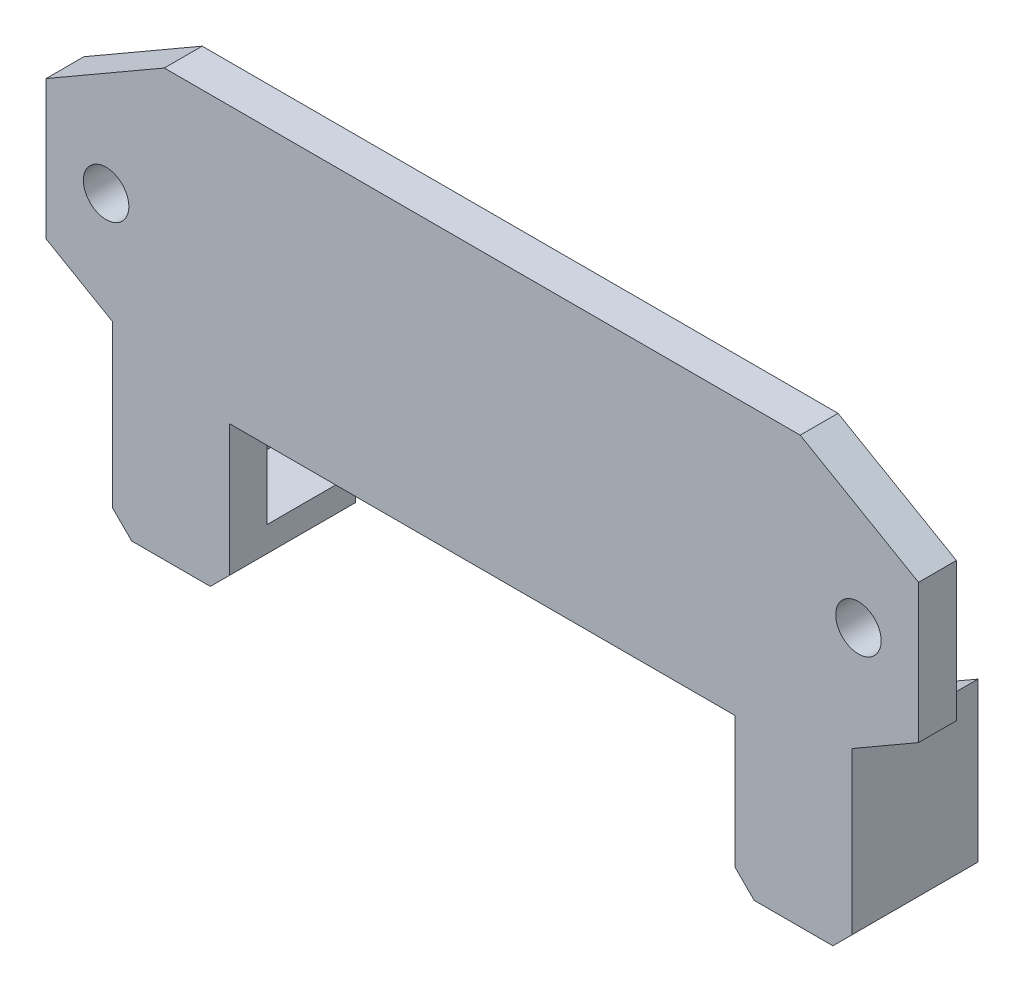
ISO-10303-21;
HEADER;
FILE_DESCRIPTION(('STEP AP214'),'2;1');
FILE_NAME('part.step','',(''),(''),'','','');
FILE_SCHEMA(('AUTOMOTIVE_DESIGN { 1 0 10303 214 1 1 1 1 }'));
ENDSEC;
DATA;
#1=APPLICATION_CONTEXT('core data for automotive mechanical design processes');
#2=APPLICATION_PROTOCOL_DEFINITION('international standard','automotive_design',2000,#1);
#3=PRODUCT_CONTEXT('',#1,'mechanical');
#4=PRODUCT('Part','Part','',(#3));
#5=PRODUCT_RELATED_PRODUCT_CATEGORY('part','',(#4));
#6=PRODUCT_DEFINITION_FORMATION('','',#4);
#7=PRODUCT_DEFINITION_CONTEXT('part definition',#1,'design');
#8=PRODUCT_DEFINITION('design','',#6,#7);
#9=PRODUCT_DEFINITION_SHAPE('','',#8);
#10=(LENGTH_UNIT() NAMED_UNIT(*) SI_UNIT(.MILLI.,.METRE.));
#11=(NAMED_UNIT(*) PLANE_ANGLE_UNIT() SI_UNIT($,.RADIAN.));
#12=(NAMED_UNIT(*) SI_UNIT($,.STERADIAN.) SOLID_ANGLE_UNIT());
#13=UNCERTAINTY_MEASURE_WITH_UNIT(LENGTH_MEASURE(1.E-05),#10,'distance_accuracy_value','');
#14=(GEOMETRIC_REPRESENTATION_CONTEXT(3) GLOBAL_UNCERTAINTY_ASSIGNED_CONTEXT((#13)) GLOBAL_UNIT_ASSIGNED_CONTEXT((#10,
#11,#12)) REPRESENTATION_CONTEXT('',''));
#15=CARTESIAN_POINT('',(0.,0.,0.));
#16=DIRECTION('',(0.,0.,1.));
#17=DIRECTION('',(1.,0.,0.));
#18=AXIS2_PLACEMENT_3D('',#15,#16,#17);
#19=CARTESIAN_POINT('',(25.2,-70.05,-7.));
#20=DIRECTION('',(0.,1.,0.));
#21=DIRECTION('',(0.,0.,1.));
#22=AXIS2_PLACEMENT_3D('',#19,#20,#21);
#23=PLANE('',#22);
#24=DIRECTION('',(-1.,0.,0.));
#25=VECTOR('',#24,1.);
#26=CARTESIAN_POINT('',(25.2,-70.05,0.));
#27=LINE('',#26,#25);
#28=CARTESIAN_POINT('',(25.2,-70.05,0.));
#29=VERTEX_POINT('',#28);
#30=CARTESIAN_POINT('',(20.05,-70.05,0.));
#31=VERTEX_POINT('',#30);
#32=EDGE_CURVE('E130',#29,#31,#27,.T.);
#33=ORIENTED_EDGE('',*,*,#32,.F.);
#34=DIRECTION('',(0.,0.,1.));
#35=VECTOR('',#34,1.);
#36=CARTESIAN_POINT('',(25.2,-70.05,-7.));
#37=LINE('',#36,#35);
#38=CARTESIAN_POINT('',(25.2,-70.05,-7.));
#39=VERTEX_POINT('',#38);
#40=EDGE_CURVE('E11',#39,#29,#37,.T.);
#41=ORIENTED_EDGE('',*,*,#40,.F.);
#42=DIRECTION('',(-1.,0.,0.));
#43=VECTOR('',#42,1.);
#44=CARTESIAN_POINT('',(25.2,-70.05,-7.));
#45=LINE('',#44,#43);
#46=CARTESIAN_POINT('',(20.05,-70.05,-7.));
#47=VERTEX_POINT('',#46);
#48=EDGE_CURVE('E137',#39,#47,#45,.T.);
#49=ORIENTED_EDGE('',*,*,#48,.T.);
#50=DIRECTION('',(0.,0.,1.));
#51=VECTOR('',#50,1.);
#52=CARTESIAN_POINT('',(20.05,-70.05,-7.));
#53=LINE('',#52,#51);
#54=EDGE_CURVE('E37',#47,#31,#53,.T.);
#55=ORIENTED_EDGE('',*,*,#54,.T.);
#56=EDGE_LOOP('',(#33,#41,#49,#55));
#57=FACE_BOUND('',#56,.T.);
#58=ADVANCED_FACE('F34',(#57),#23,.T.);
#59=CARTESIAN_POINT('',(25.2,-61.8493375672968,-7.));
#60=DIRECTION('',(-1.,0.,0.));
#61=DIRECTION('',(0.,-1.,0.));
#62=AXIS2_PLACEMENT_3D('',#59,#60,#61);
#63=PLANE('',#62);
#64=DIRECTION('',(0.,-1.,0.));
#65=VECTOR('',#64,1.);
#66=CARTESIAN_POINT('',(25.2,-61.8493375672968,0.));
#67=LINE('',#66,#65);
#68=CARTESIAN_POINT('',(25.2,-61.8493375672968,0.));
#69=VERTEX_POINT('',#68);
#70=EDGE_CURVE('E135',#69,#29,#67,.T.);
#71=ORIENTED_EDGE('',*,*,#70,.F.);
#72=DIRECTION('',(0.,0.,1.));
#73=VECTOR('',#72,1.);
#74=CARTESIAN_POINT('',(25.2,-61.8493375672968,-7.));
#75=LINE('',#74,#73);
#76=CARTESIAN_POINT('',(25.2,-61.8493375672968,-7.));
#77=VERTEX_POINT('',#76);
#78=EDGE_CURVE('E42',#77,#69,#75,.T.);
#79=ORIENTED_EDGE('',*,*,#78,.F.);
#80=DIRECTION('',(0.,-1.,0.));
#81=VECTOR('',#80,1.);
#82=CARTESIAN_POINT('',(25.2,-61.8493375672968,-7.));
#83=LINE('',#82,#81);
#84=EDGE_CURVE('E118',#77,#39,#83,.T.);
#85=ORIENTED_EDGE('',*,*,#84,.T.);
#86=ORIENTED_EDGE('',*,*,#40,.T.);
#87=EDGE_LOOP('',(#71,#79,#85,#86));
#88=FACE_BOUND('',#87,.T.);
#89=ADVANCED_FACE('F496',(#88),#63,.T.);
#90=CARTESIAN_POINT('',(25.2,-61.8493375672968,-7.));
#91=DIRECTION('',(-0.5,0.866025403784438,0.));
#92=DIRECTION('',(-0.866025403784439,-0.5,0.));
#93=AXIS2_PLACEMENT_3D('',#90,#91,#92);
#94=PLANE('',#93);
#95=DIRECTION('',(-0.866025403784438,-0.5,0.));
#96=VECTOR('',#95,1.);
#97=CARTESIAN_POINT('',(25.2,-61.8493375672968,0.));
#98=LINE('',#97,#96);
#99=CARTESIAN_POINT('',(29.2892350986239,-59.4884165823266,0.));
#100=VERTEX_POINT('',#99);
#101=EDGE_CURVE('E104',#100,#69,#98,.T.);
#102=ORIENTED_EDGE('',*,*,#101,.F.);
#103=DIRECTION('',(0.,0.,1.));
#104=VECTOR('',#103,1.);
#105=CARTESIAN_POINT('',(29.2892350986239,-59.4884165823266,-7.));
#106=LINE('',#105,#104);
#107=CARTESIAN_POINT('',(29.2892350986239,-59.4884165823266,-7.));
#108=VERTEX_POINT('',#107);
#109=EDGE_CURVE('E98',#108,#100,#106,.T.);
#110=ORIENTED_EDGE('',*,*,#109,.F.);
#111=DIRECTION('',(-0.866025403784438,-0.5,0.));
#112=VECTOR('',#111,1.);
#113=CARTESIAN_POINT('',(25.2,-61.8493375672968,-7.));
#114=LINE('',#113,#112);
#115=EDGE_CURVE('E101',#108,#77,#114,.T.);
#116=ORIENTED_EDGE('',*,*,#115,.T.);
#117=ORIENTED_EDGE('',*,*,#78,.T.);
#118=EDGE_LOOP('',(#102,#110,#116,#117));
#119=FACE_BOUND('',#118,.T.);
#120=ADVANCED_FACE('F100',(#119),#94,.T.);
#121=CARTESIAN_POINT('',(29.2892350986244,-72.05,-7.));
#122=DIRECTION('',(1.,0.,0.));
#123=DIRECTION('',(0.,1.,0.));
#124=AXIS2_PLACEMENT_3D('',#121,#122,#123);
#125=PLANE('',#124);
#126=ORIENTED_EDGE('',*,*,#109,.T.);
#127=DIRECTION('',(0.,1.,0.));
#128=VECTOR('',#127,1.);
#129=CARTESIAN_POINT('',(29.2892350986244,-72.05,0.));
#130=LINE('',#129,#128);
#131=CARTESIAN_POINT('',(29.2892350986244,-59.2574764746505,0.));
#132=VERTEX_POINT('',#131);
#133=EDGE_CURVE('E162',#100,#132,#130,.T.);
#134=ORIENTED_EDGE('',*,*,#133,.T.);
#135=DIRECTION('',(0.,0.,-1.));
#136=VECTOR('',#135,1.);
#137=CARTESIAN_POINT('',(29.2892350986244,-59.2574764746505,3.));
#138=LINE('',#137,#136);
#139=CARTESIAN_POINT('',(29.2892350986244,-59.2574764746505,3.));
#140=VERTEX_POINT('',#139);
#141=EDGE_CURVE('E178',#140,#132,#138,.T.);
#142=ORIENTED_EDGE('',*,*,#141,.F.);
#143=DIRECTION('',(0.,1.,0.));
#144=VECTOR('',#143,1.);
#145=CARTESIAN_POINT('',(29.2892350986244,-72.05,3.));
#146=LINE('',#145,#144);
#147=CARTESIAN_POINT('',(29.2892350986244,-72.05,3.));
#148=VERTEX_POINT('',#147);
#149=EDGE_CURVE('E248',#148,#140,#146,.T.);
#150=ORIENTED_EDGE('',*,*,#149,.F.);
#151=DIRECTION('',(0.,0.,1.));
#152=VECTOR('',#151,1.);
#153=CARTESIAN_POINT('',(29.2892350986244,-72.05,-7.));
#154=LINE('',#153,#152);
#155=CARTESIAN_POINT('',(29.2892350986244,-72.05,-7.));
#156=VERTEX_POINT('',#155);
#157=EDGE_CURVE('E109',#156,#148,#154,.T.);
#158=ORIENTED_EDGE('',*,*,#157,.F.);
#159=DIRECTION('',(0.,1.,0.));
#160=VECTOR('',#159,1.);
#161=CARTESIAN_POINT('',(29.2892350986244,-72.05,-7.));
#162=LINE('',#161,#160);
#163=EDGE_CURVE('E115',#156,#108,#162,.T.);
#164=ORIENTED_EDGE('',*,*,#163,.T.);
#165=EDGE_LOOP('',(#126,#134,#142,#150,#158,#164));
#166=FACE_BOUND('',#165,.T.);
#167=ADVANCED_FACE('F120',(#166),#125,.T.);
#168=CARTESIAN_POINT('',(27.7892350986244,-73.55,-7.));
#169=DIRECTION('',(0.707106781186556,-0.707106781186539,0.));
#170=DIRECTION('',(0.707106781186539,0.707106781186556,0.));
#171=AXIS2_PLACEMENT_3D('',#168,#169,#170);
#172=PLANE('',#171);
#173=ORIENTED_EDGE('',*,*,#157,.T.);
#174=DIRECTION('',(0.707106781186539,0.707106781186556,0.));
#175=VECTOR('',#174,1.);
#176=CARTESIAN_POINT('',(27.7892350986244,-73.55,3.));
#177=LINE('',#176,#175);
#178=CARTESIAN_POINT('',(27.7892350986244,-73.55,3.));
#179=VERTEX_POINT('',#178);
#180=EDGE_CURVE('E240',#179,#148,#177,.T.);
#181=ORIENTED_EDGE('',*,*,#180,.F.);
#182=DIRECTION('',(0.,0.,1.));
#183=VECTOR('',#182,1.);
#184=CARTESIAN_POINT('',(27.7892350986244,-73.55,-7.));
#185=LINE('',#184,#183);
#186=CARTESIAN_POINT('',(27.7892350986244,-73.55,-7.));
#187=VERTEX_POINT('',#186);
#188=EDGE_CURVE('E141',#187,#179,#185,.T.);
#189=ORIENTED_EDGE('',*,*,#188,.F.);
#190=DIRECTION('',(0.707106781186539,0.707106781186556,0.));
#191=VECTOR('',#190,1.);
#192=CARTESIAN_POINT('',(27.7892350986244,-73.55,-7.));
#193=LINE('',#192,#191);
#194=EDGE_CURVE('E123',#187,#156,#193,.T.);
#195=ORIENTED_EDGE('',*,*,#194,.T.);
#196=EDGE_LOOP('',(#173,#181,#189,#195));
#197=FACE_BOUND('',#196,.T.);
#198=ADVANCED_FACE('F486',(#197),#172,.T.);
#199=CARTESIAN_POINT('',(21.55,-73.55,-7.));
#200=DIRECTION('',(0.,-1.,0.));
#201=DIRECTION('',(0.,0.,-1.));
#202=AXIS2_PLACEMENT_3D('',#199,#200,#201);
#203=PLANE('',#202);
#204=ORIENTED_EDGE('',*,*,#188,.T.);
#205=DIRECTION('',(1.,0.,0.));
#206=VECTOR('',#205,1.);
#207=CARTESIAN_POINT('',(21.55,-73.55,3.));
#208=LINE('',#207,#206);
#209=CARTESIAN_POINT('',(21.55,-73.55,3.));
#210=VERTEX_POINT('',#209);
#211=EDGE_CURVE('E237',#210,#179,#208,.T.);
#212=ORIENTED_EDGE('',*,*,#211,.F.);
#213=DIRECTION('',(0.,0.,1.));
#214=VECTOR('',#213,1.);
#215=CARTESIAN_POINT('',(21.55,-73.55,-7.));
#216=LINE('',#215,#214);
#217=CARTESIAN_POINT('',(21.55,-73.55,-7.));
#218=VERTEX_POINT('',#217);
#219=EDGE_CURVE('E144',#218,#210,#216,.T.);
#220=ORIENTED_EDGE('',*,*,#219,.F.);
#221=DIRECTION('',(1.,0.,0.));
#222=VECTOR('',#221,1.);
#223=CARTESIAN_POINT('',(21.55,-73.55,-7.));
#224=LINE('',#223,#222);
#225=EDGE_CURVE('E125',#218,#187,#224,.T.);
#226=ORIENTED_EDGE('',*,*,#225,.T.);
#227=EDGE_LOOP('',(#204,#212,#220,#226));
#228=FACE_BOUND('',#227,.T.);
#229=ADVANCED_FACE('F223',(#228),#203,.T.);
#230=CARTESIAN_POINT('',(20.05,-72.05,-7.));
#231=DIRECTION('',(-0.707106781186541,-0.707106781186554,0.));
#232=DIRECTION('',(0.707106781186554,-0.707106781186541,0.));
#233=AXIS2_PLACEMENT_3D('',#230,#231,#232);
#234=PLANE('',#233);
#235=ORIENTED_EDGE('',*,*,#219,.T.);
#236=DIRECTION('',(0.707106781186554,-0.707106781186541,0.));
#237=VECTOR('',#236,1.);
#238=CARTESIAN_POINT('',(20.05,-72.05,3.));
#239=LINE('',#238,#237);
#240=CARTESIAN_POINT('',(20.05,-72.05,3.));
#241=VERTEX_POINT('',#240);
#242=EDGE_CURVE('E233',#241,#210,#239,.T.);
#243=ORIENTED_EDGE('',*,*,#242,.F.);
#244=DIRECTION('',(0.,0.,1.));
#245=VECTOR('',#244,1.);
#246=CARTESIAN_POINT('',(20.05,-72.05,-7.));
#247=LINE('',#246,#245);
#248=CARTESIAN_POINT('',(20.05,-72.05,-7.));
#249=VERTEX_POINT('',#248);
#250=EDGE_CURVE('E146',#249,#241,#247,.T.);
#251=ORIENTED_EDGE('',*,*,#250,.F.);
#252=DIRECTION('',(0.707106781186554,-0.707106781186541,0.));
#253=VECTOR('',#252,1.);
#254=CARTESIAN_POINT('',(20.05,-72.05,-7.));
#255=LINE('',#254,#253);
#256=EDGE_CURVE('E218',#249,#218,#255,.T.);
#257=ORIENTED_EDGE('',*,*,#256,.T.);
#258=EDGE_LOOP('',(#235,#243,#251,#257));
#259=FACE_BOUND('',#258,.T.);
#260=ADVANCED_FACE('F229',(#259),#234,.T.);
#261=CARTESIAN_POINT('',(20.05,-70.05,-7.));
#262=DIRECTION('',(-1.,0.,0.));
#263=DIRECTION('',(0.,0.,1.));
#264=AXIS2_PLACEMENT_3D('',#261,#262,#263);
#265=PLANE('',#264);
#266=ORIENTED_EDGE('',*,*,#250,.T.);
#267=DIRECTION('',(0.,-1.,0.));
#268=VECTOR('',#267,1.);
#269=CARTESIAN_POINT('',(20.05,-72.05,3.));
#270=LINE('',#269,#268);
#271=CARTESIAN_POINT('',(20.05,-61.6183974596209,3.));
#272=VERTEX_POINT('',#271);
#273=EDGE_CURVE('E238',#272,#241,#270,.T.);
#274=ORIENTED_EDGE('',*,*,#273,.F.);
#275=DIRECTION('',(0.,0.,-1.));
#276=VECTOR('',#275,1.);
#277=CARTESIAN_POINT('',(20.05,-61.6183974596209,3.));
#278=LINE('',#277,#276);
#279=CARTESIAN_POINT('',(20.05,-61.6183974596209,0.));
#280=VERTEX_POINT('',#279);
#281=EDGE_CURVE('E161',#272,#280,#278,.T.);
#282=ORIENTED_EDGE('',*,*,#281,.T.);
#283=DIRECTION('',(0.,-1.,0.));
#284=VECTOR('',#283,1.);
#285=CARTESIAN_POINT('',(20.05,-72.05,0.));
#286=LINE('',#285,#284);
#287=EDGE_CURVE('E157',#280,#31,#286,.T.);
#288=ORIENTED_EDGE('',*,*,#287,.T.);
#289=ORIENTED_EDGE('',*,*,#54,.F.);
#290=DIRECTION('',(0.,-1.,0.));
#291=VECTOR('',#290,1.);
#292=CARTESIAN_POINT('',(20.05,-70.05,-7.));
#293=LINE('',#292,#291);
#294=EDGE_CURVE('E216',#47,#249,#293,.T.);
#295=ORIENTED_EDGE('',*,*,#294,.T.);
#296=EDGE_LOOP('',(#266,#274,#282,#288,#289,#295));
#297=FACE_BOUND('',#296,.T.);
#298=ADVANCED_FACE('F159',(#297),#265,.T.);
#299=CARTESIAN_POINT('',(0.,0.,-7.));
#300=DIRECTION('',(0.,0.,1.));
#301=DIRECTION('',(1.,0.,0.));
#302=AXIS2_PLACEMENT_3D('',#299,#300,#301);
#303=PLANE('',#302);
#304=ORIENTED_EDGE('',*,*,#48,.F.);
#305=ORIENTED_EDGE('',*,*,#84,.F.);
#306=ORIENTED_EDGE('',*,*,#115,.F.);
#307=ORIENTED_EDGE('',*,*,#163,.F.);
#308=ORIENTED_EDGE('',*,*,#194,.F.);
#309=ORIENTED_EDGE('',*,*,#225,.F.);
#310=ORIENTED_EDGE('',*,*,#256,.F.);
#311=ORIENTED_EDGE('',*,*,#294,.F.);
#312=EDGE_LOOP('',(#304,#305,#306,#307,#308,#309,#310,#311));
#313=FACE_BOUND('',#312,.T.);
#314=ADVANCED_FACE('F113',(#313),#303,.F.);
#315=CARTESIAN_POINT('',(0.,0.,0.));
#316=DIRECTION('',(0.,0.,1.));
#317=DIRECTION('',(1.,0.,0.));
#318=AXIS2_PLACEMENT_3D('',#315,#316,#317);
#319=PLANE('',#318);
#320=CARTESIAN_POINT('',(29.8131397208144,-50.7049999999993,0.));
#321=DIRECTION('',(0.,0.,1.));
#322=DIRECTION('',(1.,0.,0.));
#323=AXIS2_PLACEMENT_3D('',#320,#321,#322);
#324=CIRCLE('',#323,1.8);
#325=CARTESIAN_POINT('',(31.6131397208144,-50.7049999999993,0.));
#326=VERTEX_POINT('',#325);
#327=EDGE_CURVE('E325',#326,#326,#324,.T.);
#328=ORIENTED_EDGE('',*,*,#327,.T.);
#329=EDGE_LOOP('',(#328));
#330=FACE_BOUND('',#329,.T.);
#331=CARTESIAN_POINT('',(-29.8131397208144,-50.7049999999993,0.));
#332=DIRECTION('',(0.,0.,1.));
#333=DIRECTION('',(-1.,0.,0.));
#334=AXIS2_PLACEMENT_3D('',#331,#332,#333);
#335=CIRCLE('',#334,1.8);
#336=CARTESIAN_POINT('',(-31.6131397208144,-50.7049999999993,0.));
#337=VERTEX_POINT('',#336);
#338=EDGE_CURVE('E331',#337,#337,#335,.T.);
#339=ORIENTED_EDGE('',*,*,#338,.T.);
#340=EDGE_LOOP('',(#339));
#341=FACE_BOUND('',#340,.T.);
#342=DIRECTION('',(0.,1.,0.));
#343=VECTOR('',#342,1.);
#344=CARTESIAN_POINT('',(-25.2,-61.8493375672968,0.));
#345=LINE('',#344,#343);
#346=CARTESIAN_POINT('',(-25.2,-70.05,0.));
#347=VERTEX_POINT('',#346);
#348=CARTESIAN_POINT('',(-25.2,-61.8493375672968,0.));
#349=VERTEX_POINT('',#348);
#350=EDGE_CURVE('E350',#347,#349,#345,.T.);
#351=ORIENTED_EDGE('',*,*,#350,.T.);
#352=DIRECTION('',(-0.866025403784438,0.5,0.));
#353=VECTOR('',#352,1.);
#354=CARTESIAN_POINT('',(-25.2,-61.8493375672968,0.));
#355=LINE('',#354,#353);
#356=CARTESIAN_POINT('',(-29.2892350986239,-59.4884165823266,0.));
#357=VERTEX_POINT('',#356);
#358=EDGE_CURVE('E346',#349,#357,#355,.T.);
#359=ORIENTED_EDGE('',*,*,#358,.T.);
#360=DIRECTION('',(0.,-1.,0.));
#361=VECTOR('',#360,1.);
#362=CARTESIAN_POINT('',(-29.2892350986244,-72.05,0.));
#363=LINE('',#362,#361);
#364=CARTESIAN_POINT('',(-29.2892350986244,-59.2574764746505,0.));
#365=VERTEX_POINT('',#364);
#366=EDGE_CURVE('E272',#365,#357,#363,.T.);
#367=ORIENTED_EDGE('',*,*,#366,.F.);
#368=DIRECTION('',(0.866025403784439,-0.5,0.));
#369=VECTOR('',#368,1.);
#370=CARTESIAN_POINT('',(-29.2892350986244,-59.2574764746505,0.));
#371=LINE('',#370,#369);
#372=CARTESIAN_POINT('',(-34.5762794416288,-56.2049999999993,0.));
#373=VERTEX_POINT('',#372);
#374=EDGE_CURVE('E269',#373,#365,#371,.T.);
#375=ORIENTED_EDGE('',*,*,#374,.F.);
#376=DIRECTION('',(0.,-1.,0.));
#377=VECTOR('',#376,1.);
#378=CARTESIAN_POINT('',(-34.5762794416288,-56.2049999999993,0.));
#379=LINE('',#378,#377);
#380=CARTESIAN_POINT('',(-34.5762794416288,-45.2049999999993,0.));
#381=VERTEX_POINT('',#380);
#382=EDGE_CURVE('E266',#381,#373,#379,.T.);
#383=ORIENTED_EDGE('',*,*,#382,.F.);
#384=DIRECTION('',(-0.866025403784439,-0.499999999999999,0.));
#385=VECTOR('',#384,1.);
#386=CARTESIAN_POINT('',(-34.5762794416288,-45.2049999999993,0.));
#387=LINE('',#386,#385);
#388=CARTESIAN_POINT('',(-25.2,-39.7916025403778,0.));
#389=VERTEX_POINT('',#388);
#390=EDGE_CURVE('E263',#389,#381,#387,.T.);
#391=ORIENTED_EDGE('',*,*,#390,.F.);
#392=DIRECTION('',(-1.,0.,0.));
#393=VECTOR('',#392,1.);
#394=CARTESIAN_POINT('',(25.2,-39.7916025403778,0.));
#395=LINE('',#394,#393);
#396=CARTESIAN_POINT('',(25.2,-39.7916025403778,0.));
#397=VERTEX_POINT('',#396);
#398=EDGE_CURVE('E260',#397,#389,#395,.T.);
#399=ORIENTED_EDGE('',*,*,#398,.F.);
#400=DIRECTION('',(-0.866025403784439,0.499999999999999,0.));
#401=VECTOR('',#400,1.);
#402=CARTESIAN_POINT('',(34.5762794416288,-45.2049999999993,0.));
#403=LINE('',#402,#401);
#404=CARTESIAN_POINT('',(34.5762794416288,-45.2049999999993,0.));
#405=VERTEX_POINT('',#404);
#406=EDGE_CURVE('E256',#405,#397,#403,.T.);
#407=ORIENTED_EDGE('',*,*,#406,.F.);
#408=DIRECTION('',(0.,1.,0.));
#409=VECTOR('',#408,1.);
#410=CARTESIAN_POINT('',(34.5762794416288,-56.2049999999993,0.));
#411=LINE('',#410,#409);
#412=CARTESIAN_POINT('',(34.5762794416288,-56.2049999999993,0.));
#413=VERTEX_POINT('',#412);
#414=EDGE_CURVE('E253',#413,#405,#411,.T.);
#415=ORIENTED_EDGE('',*,*,#414,.F.);
#416=DIRECTION('',(0.866025403784439,0.5,0.));
#417=VECTOR('',#416,1.);
#418=CARTESIAN_POINT('',(29.2892350986244,-59.2574764746505,0.));
#419=LINE('',#418,#417);
#420=EDGE_CURVE('E165',#132,#413,#419,.T.);
#421=ORIENTED_EDGE('',*,*,#420,.F.);
#422=ORIENTED_EDGE('',*,*,#133,.F.);
#423=ORIENTED_EDGE('',*,*,#101,.T.);
#424=ORIENTED_EDGE('',*,*,#70,.T.);
#425=ORIENTED_EDGE('',*,*,#32,.T.);
#426=ORIENTED_EDGE('',*,*,#287,.F.);
#427=DIRECTION('',(1.,0.,0.));
#428=VECTOR('',#427,1.);
#429=CARTESIAN_POINT('',(20.05,-61.6183974596209,0.));
#430=LINE('',#429,#428);
#431=CARTESIAN_POINT('',(-20.05,-61.6183974596209,0.));
#432=VERTEX_POINT('',#431);
#433=EDGE_CURVE('E163',#432,#280,#430,.T.);
#434=ORIENTED_EDGE('',*,*,#433,.F.);
#435=DIRECTION('',(0.,1.,0.));
#436=VECTOR('',#435,1.);
#437=CARTESIAN_POINT('',(-20.05,-72.05,0.));
#438=LINE('',#437,#436);
#439=CARTESIAN_POINT('',(-20.05,-70.05,0.));
#440=VERTEX_POINT('',#439);
#441=EDGE_CURVE('E168',#440,#432,#438,.T.);
#442=ORIENTED_EDGE('',*,*,#441,.F.);
#443=DIRECTION('',(-1.,0.,0.));
#444=VECTOR('',#443,1.);
#445=CARTESIAN_POINT('',(-25.2,-70.05,0.));
#446=LINE('',#445,#444);
#447=EDGE_CURVE('E50',#440,#347,#446,.T.);
#448=ORIENTED_EDGE('',*,*,#447,.T.);
#449=EDGE_LOOP('',(#351,#359,#367,#375,#383,#391,#399,#407,#415,#421,#422,#423,#424,#425,#426,
#434,#442,#448));
#450=FACE_BOUND('',#449,.T.);
#451=ADVANCED_FACE('F154',(#330,#341,#450),#319,.F.);
#452=CARTESIAN_POINT('',(0.,0.,3.));
#453=DIRECTION('',(0.,0.,1.));
#454=DIRECTION('',(1.,0.,0.));
#455=AXIS2_PLACEMENT_3D('',#452,#453,#454);
#456=PLANE('',#455);
#457=CARTESIAN_POINT('',(29.8131397208144,-50.7049999999993,3.));
#458=DIRECTION('',(0.,0.,1.));
#459=DIRECTION('',(1.,0.,0.));
#460=AXIS2_PLACEMENT_3D('',#457,#458,#459);
#461=CIRCLE('',#460,1.8);
#462=CARTESIAN_POINT('',(31.6131397208144,-50.7049999999993,3.));
#463=VERTEX_POINT('',#462);
#464=EDGE_CURVE('E257',#463,#463,#461,.T.);
#465=ORIENTED_EDGE('',*,*,#464,.F.);
#466=EDGE_LOOP('',(#465));
#467=FACE_BOUND('',#466,.T.);
#468=DIRECTION('',(0.,1.,0.));
#469=VECTOR('',#468,1.);
#470=CARTESIAN_POINT('',(34.5762794416288,-56.2049999999993,3.));
#471=LINE('',#470,#469);
#472=CARTESIAN_POINT('',(34.5762794416288,-56.2049999999993,3.));
#473=VERTEX_POINT('',#472);
#474=CARTESIAN_POINT('',(34.5762794416288,-45.2049999999993,3.));
#475=VERTEX_POINT('',#474);
#476=EDGE_CURVE('E174',#473,#475,#471,.T.);
#477=ORIENTED_EDGE('',*,*,#476,.T.);
#478=DIRECTION('',(-0.866025403784439,0.499999999999999,0.));
#479=VECTOR('',#478,1.);
#480=CARTESIAN_POINT('',(34.5762794416288,-45.2049999999993,3.));
#481=LINE('',#480,#479);
#482=CARTESIAN_POINT('',(25.2,-39.7916025403778,3.));
#483=VERTEX_POINT('',#482);
#484=EDGE_CURVE('E320',#475,#483,#481,.T.);
#485=ORIENTED_EDGE('',*,*,#484,.T.);
#486=DIRECTION('',(-1.,0.,0.));
#487=VECTOR('',#486,1.);
#488=CARTESIAN_POINT('',(25.2,-39.7916025403778,3.));
#489=LINE('',#488,#487);
#490=CARTESIAN_POINT('',(-25.2,-39.7916025403778,3.));
#491=VERTEX_POINT('',#490);
#492=EDGE_CURVE('E317',#483,#491,#489,.T.);
#493=ORIENTED_EDGE('',*,*,#492,.T.);
#494=DIRECTION('',(-0.866025403784439,-0.499999999999999,0.));
#495=VECTOR('',#494,1.);
#496=CARTESIAN_POINT('',(-34.5762794416288,-45.2049999999993,3.));
#497=LINE('',#496,#495);
#498=CARTESIAN_POINT('',(-34.5762794416288,-45.2049999999993,3.));
#499=VERTEX_POINT('',#498);
#500=EDGE_CURVE('E314',#491,#499,#497,.T.);
#501=ORIENTED_EDGE('',*,*,#500,.T.);
#502=DIRECTION('',(0.,-1.,0.));
#503=VECTOR('',#502,1.);
#504=CARTESIAN_POINT('',(-34.5762794416288,-56.2049999999993,3.));
#505=LINE('',#504,#503);
#506=CARTESIAN_POINT('',(-34.5762794416288,-56.2049999999993,3.));
#507=VERTEX_POINT('',#506);
#508=EDGE_CURVE('E311',#499,#507,#505,.T.);
#509=ORIENTED_EDGE('',*,*,#508,.T.);
#510=DIRECTION('',(0.866025403784439,-0.5,0.));
#511=VECTOR('',#510,1.);
#512=CARTESIAN_POINT('',(-29.2892350986244,-59.2574764746505,3.));
#513=LINE('',#512,#511);
#514=CARTESIAN_POINT('',(-29.2892350986244,-59.2574764746505,3.));
#515=VERTEX_POINT('',#514);
#516=EDGE_CURVE('E308',#507,#515,#513,.T.);
#517=ORIENTED_EDGE('',*,*,#516,.T.);
#518=DIRECTION('',(0.,-1.,0.));
#519=VECTOR('',#518,1.);
#520=CARTESIAN_POINT('',(-29.2892350986244,-72.05,3.));
#521=LINE('',#520,#519);
#522=CARTESIAN_POINT('',(-29.2892350986244,-72.05,3.));
#523=VERTEX_POINT('',#522);
#524=EDGE_CURVE('E305',#515,#523,#521,.T.);
#525=ORIENTED_EDGE('',*,*,#524,.T.);
#526=DIRECTION('',(0.707106781186539,-0.707106781186556,0.));
#527=VECTOR('',#526,1.);
#528=CARTESIAN_POINT('',(-27.7892350986244,-73.55,3.));
#529=LINE('',#528,#527);
#530=CARTESIAN_POINT('',(-27.7892350986244,-73.55,3.));
#531=VERTEX_POINT('',#530);
#532=EDGE_CURVE('E302',#523,#531,#529,.T.);
#533=ORIENTED_EDGE('',*,*,#532,.T.);
#534=DIRECTION('',(1.,0.,0.));
#535=VECTOR('',#534,1.);
#536=CARTESIAN_POINT('',(-21.55,-73.55,3.));
#537=LINE('',#536,#535);
#538=CARTESIAN_POINT('',(-21.55,-73.55,3.));
#539=VERTEX_POINT('',#538);
#540=EDGE_CURVE('E299',#531,#539,#537,.T.);
#541=ORIENTED_EDGE('',*,*,#540,.T.);
#542=DIRECTION('',(0.707106781186554,0.707106781186541,0.));
#543=VECTOR('',#542,1.);
#544=CARTESIAN_POINT('',(-20.05,-72.05,3.));
#545=LINE('',#544,#543);
#546=CARTESIAN_POINT('',(-20.05,-72.05,3.));
#547=VERTEX_POINT('',#546);
#548=EDGE_CURVE('E294',#539,#547,#545,.T.);
#549=ORIENTED_EDGE('',*,*,#548,.T.);
#550=DIRECTION('',(0.,1.,0.));
#551=VECTOR('',#550,1.);
#552=CARTESIAN_POINT('',(-20.05,-72.05,3.));
#553=LINE('',#552,#551);
#554=CARTESIAN_POINT('',(-20.05,-61.6183974596209,3.));
#555=VERTEX_POINT('',#554);
#556=EDGE_CURVE('E293',#547,#555,#553,.T.);
#557=ORIENTED_EDGE('',*,*,#556,.T.);
#558=DIRECTION('',(1.,0.,0.));
#559=VECTOR('',#558,1.);
#560=CARTESIAN_POINT('',(20.05,-61.6183974596209,3.));
#561=LINE('',#560,#559);
#562=EDGE_CURVE('E242',#555,#272,#561,.T.);
#563=ORIENTED_EDGE('',*,*,#562,.T.);
#564=ORIENTED_EDGE('',*,*,#273,.T.);
#565=ORIENTED_EDGE('',*,*,#242,.T.);
#566=ORIENTED_EDGE('',*,*,#211,.T.);
#567=ORIENTED_EDGE('',*,*,#180,.T.);
#568=ORIENTED_EDGE('',*,*,#149,.T.);
#569=DIRECTION('',(0.866025403784439,0.5,0.));
#570=VECTOR('',#569,1.);
#571=CARTESIAN_POINT('',(29.2892350986244,-59.2574764746505,3.));
#572=LINE('',#571,#570);
#573=EDGE_CURVE('E179',#140,#473,#572,.T.);
#574=ORIENTED_EDGE('',*,*,#573,.T.);
#575=EDGE_LOOP('',(#477,#485,#493,#501,#509,#517,#525,#533,#541,#549,#557,#563,#564,#565,#566,
#567,#568,#574));
#576=FACE_BOUND('',#575,.T.);
#577=CARTESIAN_POINT('',(-29.8131397208144,-50.7049999999993,3.));
#578=DIRECTION('',(0.,0.,1.));
#579=DIRECTION('',(-1.,0.,0.));
#580=AXIS2_PLACEMENT_3D('',#577,#578,#579);
#581=CIRCLE('',#580,1.8);
#582=CARTESIAN_POINT('',(-31.6131397208144,-50.7049999999993,3.));
#583=VERTEX_POINT('',#582);
#584=EDGE_CURVE('E328',#583,#583,#581,.T.);
#585=ORIENTED_EDGE('',*,*,#584,.F.);
#586=EDGE_LOOP('',(#585));
#587=FACE_BOUND('',#586,.T.);
#588=ADVANCED_FACE('F482',(#467,#576,#587),#456,.T.);
#589=CARTESIAN_POINT('',(34.5762794416288,-56.2049999999993,3.));
#590=DIRECTION('',(-1.,0.,0.));
#591=DIRECTION('',(0.,0.,1.));
#592=AXIS2_PLACEMENT_3D('',#589,#590,#591);
#593=PLANE('',#592);
#594=ORIENTED_EDGE('',*,*,#414,.T.);
#595=DIRECTION('',(0.,0.,-1.));
#596=VECTOR('',#595,1.);
#597=CARTESIAN_POINT('',(34.5762794416288,-45.2049999999993,3.));
#598=LINE('',#597,#596);
#599=EDGE_CURVE('E133',#475,#405,#598,.T.);
#600=ORIENTED_EDGE('',*,*,#599,.F.);
#601=ORIENTED_EDGE('',*,*,#476,.F.);
#602=DIRECTION('',(0.,0.,-1.));
#603=VECTOR('',#602,1.);
#604=CARTESIAN_POINT('',(34.5762794416288,-56.2049999999993,3.));
#605=LINE('',#604,#603);
#606=EDGE_CURVE('E175',#473,#413,#605,.T.);
#607=ORIENTED_EDGE('',*,*,#606,.T.);
#608=EDGE_LOOP('',(#594,#600,#601,#607));
#609=FACE_BOUND('',#608,.T.);
#610=ADVANCED_FACE('F474',(#609),#593,.F.);
#611=CARTESIAN_POINT('',(34.5762794416288,-45.2049999999993,3.));
#612=DIRECTION('',(-0.499999999999999,-0.866025403784439,0.));
#613=DIRECTION('',(0.866025403784439,-0.499999999999999,0.));
#614=AXIS2_PLACEMENT_3D('',#611,#612,#613);
#615=PLANE('',#614);
#616=ORIENTED_EDGE('',*,*,#406,.T.);
#617=DIRECTION('',(0.,0.,-1.));
#618=VECTOR('',#617,1.);
#619=CARTESIAN_POINT('',(25.2,-39.7916025403778,3.));
#620=LINE('',#619,#618);
#621=EDGE_CURVE('E210',#483,#397,#620,.T.);
#622=ORIENTED_EDGE('',*,*,#621,.F.);
#623=ORIENTED_EDGE('',*,*,#484,.F.);
#624=ORIENTED_EDGE('',*,*,#599,.T.);
#625=EDGE_LOOP('',(#616,#622,#623,#624));
#626=FACE_BOUND('',#625,.T.);
#627=ADVANCED_FACE('F480',(#626),#615,.F.);
#628=CARTESIAN_POINT('',(25.2,-39.7916025403778,3.));
#629=DIRECTION('',(0.,-1.,0.));
#630=DIRECTION('',(0.,0.,-1.));
#631=AXIS2_PLACEMENT_3D('',#628,#629,#630);
#632=PLANE('',#631);
#633=ORIENTED_EDGE('',*,*,#398,.T.);
#634=DIRECTION('',(0.,0.,-1.));
#635=VECTOR('',#634,1.);
#636=CARTESIAN_POINT('',(-25.2,-39.7916025403778,3.));
#637=LINE('',#636,#635);
#638=EDGE_CURVE('E207',#491,#389,#637,.T.);
#639=ORIENTED_EDGE('',*,*,#638,.F.);
#640=ORIENTED_EDGE('',*,*,#492,.F.);
#641=ORIENTED_EDGE('',*,*,#621,.T.);
#642=EDGE_LOOP('',(#633,#639,#640,#641));
#643=FACE_BOUND('',#642,.T.);
#644=ADVANCED_FACE('F513',(#643),#632,.F.);
#645=CARTESIAN_POINT('',(-34.5762794416288,-45.2049999999993,3.));
#646=DIRECTION('',(0.499999999999999,-0.866025403784439,0.));
#647=DIRECTION('',(0.866025403784439,0.499999999999999,0.));
#648=AXIS2_PLACEMENT_3D('',#645,#646,#647);
#649=PLANE('',#648);
#650=ORIENTED_EDGE('',*,*,#390,.T.);
#651=DIRECTION('',(0.,0.,-1.));
#652=VECTOR('',#651,1.);
#653=CARTESIAN_POINT('',(-34.5762794416288,-45.2049999999993,3.));
#654=LINE('',#653,#652);
#655=EDGE_CURVE('E204',#499,#381,#654,.T.);
#656=ORIENTED_EDGE('',*,*,#655,.F.);
#657=ORIENTED_EDGE('',*,*,#500,.F.);
#658=ORIENTED_EDGE('',*,*,#638,.T.);
#659=EDGE_LOOP('',(#650,#656,#657,#658));
#660=FACE_BOUND('',#659,.T.);
#661=ADVANCED_FACE('F516',(#660),#649,.F.);
#662=CARTESIAN_POINT('',(-34.5762794416288,-56.2049999999993,3.));
#663=DIRECTION('',(1.,0.,0.));
#664=DIRECTION('',(0.,0.,-1.));
#665=AXIS2_PLACEMENT_3D('',#662,#663,#664);
#666=PLANE('',#665);
#667=ORIENTED_EDGE('',*,*,#382,.T.);
#668=DIRECTION('',(0.,0.,-1.));
#669=VECTOR('',#668,1.);
#670=CARTESIAN_POINT('',(-34.5762794416288,-56.2049999999993,3.));
#671=LINE('',#670,#669);
#672=EDGE_CURVE('E201',#507,#373,#671,.T.);
#673=ORIENTED_EDGE('',*,*,#672,.F.);
#674=ORIENTED_EDGE('',*,*,#508,.F.);
#675=ORIENTED_EDGE('',*,*,#655,.T.);
#676=EDGE_LOOP('',(#667,#673,#674,#675));
#677=FACE_BOUND('',#676,.T.);
#678=ADVANCED_FACE('F520',(#677),#666,.F.);
#679=CARTESIAN_POINT('',(-29.2892350986244,-59.2574764746505,3.));
#680=DIRECTION('',(0.5,0.866025403784439,0.));
#681=DIRECTION('',(-0.866025403784439,0.5,0.));
#682=AXIS2_PLACEMENT_3D('',#679,#680,#681);
#683=PLANE('',#682);
#684=ORIENTED_EDGE('',*,*,#374,.T.);
#685=DIRECTION('',(0.,0.,-1.));
#686=VECTOR('',#685,1.);
#687=CARTESIAN_POINT('',(-29.2892350986244,-59.2574764746505,3.));
#688=LINE('',#687,#686);
#689=EDGE_CURVE('E198',#515,#365,#688,.T.);
#690=ORIENTED_EDGE('',*,*,#689,.F.);
#691=ORIENTED_EDGE('',*,*,#516,.F.);
#692=ORIENTED_EDGE('',*,*,#672,.T.);
#693=EDGE_LOOP('',(#684,#690,#691,#692));
#694=FACE_BOUND('',#693,.T.);
#695=ADVANCED_FACE('F524',(#694),#683,.F.);
#696=CARTESIAN_POINT('',(-29.2892350986244,-72.05,3.));
#697=DIRECTION('',(1.,0.,0.));
#698=DIRECTION('',(0.,0.,-1.));
#699=AXIS2_PLACEMENT_3D('',#696,#697,#698);
#700=PLANE('',#699);
#701=ORIENTED_EDGE('',*,*,#366,.T.);
#702=DIRECTION('',(0.,0.,1.));
#703=VECTOR('',#702,1.);
#704=CARTESIAN_POINT('',(-29.2892350986239,-59.4884165823266,-7.));
#705=LINE('',#704,#703);
#706=CARTESIAN_POINT('',(-29.2892350986239,-59.4884165823266,-7.));
#707=VERTEX_POINT('',#706);
#708=EDGE_CURVE('E334',#707,#357,#705,.T.);
#709=ORIENTED_EDGE('',*,*,#708,.F.);
#710=DIRECTION('',(0.,-1.,0.));
#711=VECTOR('',#710,1.);
#712=CARTESIAN_POINT('',(-29.2892350986244,-72.05,-7.));
#713=LINE('',#712,#711);
#714=CARTESIAN_POINT('',(-29.2892350986244,-72.05,-7.));
#715=VERTEX_POINT('',#714);
#716=EDGE_CURVE('E339',#707,#715,#713,.T.);
#717=ORIENTED_EDGE('',*,*,#716,.T.);
#718=DIRECTION('',(0.,0.,-1.));
#719=VECTOR('',#718,1.);
#720=CARTESIAN_POINT('',(-29.2892350986244,-72.05,3.));
#721=LINE('',#720,#719);
#722=EDGE_CURVE('E195',#523,#715,#721,.T.);
#723=ORIENTED_EDGE('',*,*,#722,.F.);
#724=ORIENTED_EDGE('',*,*,#524,.F.);
#725=ORIENTED_EDGE('',*,*,#689,.T.);
#726=EDGE_LOOP('',(#701,#709,#717,#723,#724,#725));
#727=FACE_BOUND('',#726,.T.);
#728=ADVANCED_FACE('F397',(#727),#700,.F.);
#729=CARTESIAN_POINT('',(-27.7892350986244,-73.55,3.));
#730=DIRECTION('',(0.707106781186556,0.707106781186539,0.));
#731=DIRECTION('',(-0.707106781186539,0.707106781186556,0.));
#732=AXIS2_PLACEMENT_3D('',#729,#730,#731);
#733=PLANE('',#732);
#734=ORIENTED_EDGE('',*,*,#722,.T.);
#735=DIRECTION('',(0.707106781186539,-0.707106781186556,0.));
#736=VECTOR('',#735,1.);
#737=CARTESIAN_POINT('',(-27.7892350986244,-73.55,-7.));
#738=LINE('',#737,#736);
#739=CARTESIAN_POINT('',(-27.7892350986244,-73.55,-7.));
#740=VERTEX_POINT('',#739);
#741=EDGE_CURVE('E349',#715,#740,#738,.T.);
#742=ORIENTED_EDGE('',*,*,#741,.T.);
#743=DIRECTION('',(0.,0.,-1.));
#744=VECTOR('',#743,1.);
#745=CARTESIAN_POINT('',(-27.7892350986244,-73.55,3.));
#746=LINE('',#745,#744);
#747=EDGE_CURVE('E192',#531,#740,#746,.T.);
#748=ORIENTED_EDGE('',*,*,#747,.F.);
#749=ORIENTED_EDGE('',*,*,#532,.F.);
#750=EDGE_LOOP('',(#734,#742,#748,#749));
#751=FACE_BOUND('',#750,.T.);
#752=ADVANCED_FACE('F377',(#751),#733,.F.);
#753=CARTESIAN_POINT('',(-21.55,-73.55,3.));
#754=DIRECTION('',(0.,1.,0.));
#755=DIRECTION('',(0.,0.,1.));
#756=AXIS2_PLACEMENT_3D('',#753,#754,#755);
#757=PLANE('',#756);
#758=ORIENTED_EDGE('',*,*,#747,.T.);
#759=DIRECTION('',(1.,0.,0.));
#760=VECTOR('',#759,1.);
#761=CARTESIAN_POINT('',(-21.55,-73.55,-7.));
#762=LINE('',#761,#760);
#763=CARTESIAN_POINT('',(-21.55,-73.55,-7.));
#764=VERTEX_POINT('',#763);
#765=EDGE_CURVE('E369',#740,#764,#762,.T.);
#766=ORIENTED_EDGE('',*,*,#765,.T.);
#767=DIRECTION('',(0.,0.,-1.));
#768=VECTOR('',#767,1.);
#769=CARTESIAN_POINT('',(-21.55,-73.55,3.));
#770=LINE('',#769,#768);
#771=EDGE_CURVE('E189',#539,#764,#770,.T.);
#772=ORIENTED_EDGE('',*,*,#771,.F.);
#773=ORIENTED_EDGE('',*,*,#540,.F.);
#774=EDGE_LOOP('',(#758,#766,#772,#773));
#775=FACE_BOUND('',#774,.T.);
#776=ADVANCED_FACE('F533',(#775),#757,.F.);
#777=CARTESIAN_POINT('',(-20.05,-72.05,3.));
#778=DIRECTION('',(-0.707106781186541,0.707106781186554,0.));
#779=DIRECTION('',(-0.707106781186554,-0.707106781186541,0.));
#780=AXIS2_PLACEMENT_3D('',#777,#778,#779);
#781=PLANE('',#780);
#782=ORIENTED_EDGE('',*,*,#771,.T.);
#783=DIRECTION('',(0.707106781186554,0.707106781186541,0.));
#784=VECTOR('',#783,1.);
#785=CARTESIAN_POINT('',(-20.05,-72.05,-7.));
#786=LINE('',#785,#784);
#787=CARTESIAN_POINT('',(-20.05,-72.05,-7.));
#788=VERTEX_POINT('',#787);
#789=EDGE_CURVE('E366',#764,#788,#786,.T.);
#790=ORIENTED_EDGE('',*,*,#789,.T.);
#791=DIRECTION('',(0.,0.,-1.));
#792=VECTOR('',#791,1.);
#793=CARTESIAN_POINT('',(-20.05,-72.05,3.));
#794=LINE('',#793,#792);
#795=EDGE_CURVE('E186',#547,#788,#794,.T.);
#796=ORIENTED_EDGE('',*,*,#795,.F.);
#797=ORIENTED_EDGE('',*,*,#548,.F.);
#798=EDGE_LOOP('',(#782,#790,#796,#797));
#799=FACE_BOUND('',#798,.T.);
#800=ADVANCED_FACE('F536',(#799),#781,.F.);
#801=CARTESIAN_POINT('',(-20.05,-72.05,3.));
#802=DIRECTION('',(-1.,0.,0.));
#803=DIRECTION('',(0.,0.,1.));
#804=AXIS2_PLACEMENT_3D('',#801,#802,#803);
#805=PLANE('',#804);
#806=ORIENTED_EDGE('',*,*,#795,.T.);
#807=DIRECTION('',(0.,1.,0.));
#808=VECTOR('',#807,1.);
#809=CARTESIAN_POINT('',(-20.05,-70.05,-7.));
#810=LINE('',#809,#808);
#811=CARTESIAN_POINT('',(-20.05,-70.05,-7.));
#812=VERTEX_POINT('',#811);
#813=EDGE_CURVE('E364',#788,#812,#810,.T.);
#814=ORIENTED_EDGE('',*,*,#813,.T.);
#815=DIRECTION('',(0.,0.,1.));
#816=VECTOR('',#815,1.);
#817=CARTESIAN_POINT('',(-20.05,-70.05,-7.));
#818=LINE('',#817,#816);
#819=EDGE_CURVE('E284',#812,#440,#818,.T.);
#820=ORIENTED_EDGE('',*,*,#819,.T.);
#821=ORIENTED_EDGE('',*,*,#441,.T.);
#822=DIRECTION('',(0.,0.,-1.));
#823=VECTOR('',#822,1.);
#824=CARTESIAN_POINT('',(-20.05,-61.6183974596209,3.));
#825=LINE('',#824,#823);
#826=EDGE_CURVE('E183',#555,#432,#825,.T.);
#827=ORIENTED_EDGE('',*,*,#826,.F.);
#828=ORIENTED_EDGE('',*,*,#556,.F.);
#829=EDGE_LOOP('',(#806,#814,#820,#821,#827,#828));
#830=FACE_BOUND('',#829,.T.);
#831=ADVANCED_FACE('F279',(#830),#805,.F.);
#832=CARTESIAN_POINT('',(20.05,-61.6183974596209,3.));
#833=DIRECTION('',(0.,1.,0.));
#834=DIRECTION('',(0.,0.,1.));
#835=AXIS2_PLACEMENT_3D('',#832,#833,#834);
#836=PLANE('',#835);
#837=ORIENTED_EDGE('',*,*,#433,.T.);
#838=ORIENTED_EDGE('',*,*,#281,.F.);
#839=ORIENTED_EDGE('',*,*,#562,.F.);
#840=ORIENTED_EDGE('',*,*,#826,.T.);
#841=EDGE_LOOP('',(#837,#838,#839,#840));
#842=FACE_BOUND('',#841,.T.);
#843=ADVANCED_FACE('F288',(#842),#836,.F.);
#844=CARTESIAN_POINT('',(29.2892350986244,-59.2574764746505,3.));
#845=DIRECTION('',(-0.5,0.866025403784439,0.));
#846=DIRECTION('',(-0.866025403784439,-0.5,0.));
#847=AXIS2_PLACEMENT_3D('',#844,#845,#846);
#848=PLANE('',#847);
#849=ORIENTED_EDGE('',*,*,#420,.T.);
#850=ORIENTED_EDGE('',*,*,#606,.F.);
#851=ORIENTED_EDGE('',*,*,#573,.F.);
#852=ORIENTED_EDGE('',*,*,#141,.T.);
#853=EDGE_LOOP('',(#849,#850,#851,#852));
#854=FACE_BOUND('',#853,.T.);
#855=ADVANCED_FACE('F468',(#854),#848,.F.);
#856=CARTESIAN_POINT('',(29.8131397208144,-50.7049999999993,3.));
#857=DIRECTION('',(0.,0.,-1.));
#858=DIRECTION('',(-1.,0.,0.));
#859=AXIS2_PLACEMENT_3D('',#856,#857,#858);
#860=CYLINDRICAL_SURFACE('',#859,1.8);
#861=ORIENTED_EDGE('',*,*,#464,.T.);
#862=EDGE_LOOP('',(#861));
#863=FACE_BOUND('',#862,.T.);
#864=ORIENTED_EDGE('',*,*,#327,.F.);
#865=EDGE_LOOP('',(#864));
#866=FACE_BOUND('',#865,.T.);
#867=ADVANCED_FACE('F547',(#863,#866),#860,.F.);
#868=CARTESIAN_POINT('',(-29.8131397208144,-50.7049999999993,3.));
#869=DIRECTION('',(0.,0.,-1.));
#870=DIRECTION('',(-1.,0.,0.));
#871=AXIS2_PLACEMENT_3D('',#868,#869,#870);
#872=CYLINDRICAL_SURFACE('',#871,1.8);
#873=ORIENTED_EDGE('',*,*,#584,.T.);
#874=EDGE_LOOP('',(#873));
#875=FACE_BOUND('',#874,.T.);
#876=ORIENTED_EDGE('',*,*,#338,.F.);
#877=EDGE_LOOP('',(#876));
#878=FACE_BOUND('',#877,.T.);
#879=ADVANCED_FACE('F556',(#875,#878),#872,.F.);
#880=CARTESIAN_POINT('',(-25.2,-61.8493375672968,-7.));
#881=DIRECTION('',(0.5,0.866025403784438,0.));
#882=DIRECTION('',(-0.866025403784439,0.5,0.));
#883=AXIS2_PLACEMENT_3D('',#880,#881,#882);
#884=PLANE('',#883);
#885=ORIENTED_EDGE('',*,*,#358,.F.);
#886=DIRECTION('',(0.,0.,1.));
#887=VECTOR('',#886,1.);
#888=CARTESIAN_POINT('',(-25.2,-61.8493375672968,-7.));
#889=LINE('',#888,#887);
#890=CARTESIAN_POINT('',(-25.2,-61.8493375672968,-7.));
#891=VERTEX_POINT('',#890);
#892=EDGE_CURVE('E341',#891,#349,#889,.T.);
#893=ORIENTED_EDGE('',*,*,#892,.F.);
#894=DIRECTION('',(-0.866025403784438,0.5,0.));
#895=VECTOR('',#894,1.);
#896=CARTESIAN_POINT('',(-25.2,-61.8493375672968,-7.));
#897=LINE('',#896,#895);
#898=EDGE_CURVE('E355',#891,#707,#897,.T.);
#899=ORIENTED_EDGE('',*,*,#898,.T.);
#900=ORIENTED_EDGE('',*,*,#708,.T.);
#901=EDGE_LOOP('',(#885,#893,#899,#900));
#902=FACE_BOUND('',#901,.T.);
#903=ADVANCED_FACE('F406',(#902),#884,.T.);
#904=CARTESIAN_POINT('',(-25.2,-61.8493375672968,-7.));
#905=DIRECTION('',(1.,0.,0.));
#906=DIRECTION('',(0.,1.,0.));
#907=AXIS2_PLACEMENT_3D('',#904,#905,#906);
#908=PLANE('',#907);
#909=ORIENTED_EDGE('',*,*,#350,.F.);
#910=DIRECTION('',(0.,0.,1.));
#911=VECTOR('',#910,1.);
#912=CARTESIAN_POINT('',(-25.2,-70.05,-7.));
#913=LINE('',#912,#911);
#914=CARTESIAN_POINT('',(-25.2,-70.05,-7.));
#915=VERTEX_POINT('',#914);
#916=EDGE_CURVE('E338',#915,#347,#913,.T.);
#917=ORIENTED_EDGE('',*,*,#916,.F.);
#918=DIRECTION('',(0.,1.,0.));
#919=VECTOR('',#918,1.);
#920=CARTESIAN_POINT('',(-25.2,-61.8493375672968,-7.));
#921=LINE('',#920,#919);
#922=EDGE_CURVE('E358',#915,#891,#921,.T.);
#923=ORIENTED_EDGE('',*,*,#922,.T.);
#924=ORIENTED_EDGE('',*,*,#892,.T.);
#925=EDGE_LOOP('',(#909,#917,#923,#924));
#926=FACE_BOUND('',#925,.T.);
#927=ADVANCED_FACE('F414',(#926),#908,.T.);
#928=CARTESIAN_POINT('',(-25.2,-70.05,-7.));
#929=DIRECTION('',(0.,1.,0.));
#930=DIRECTION('',(0.,0.,1.));
#931=AXIS2_PLACEMENT_3D('',#928,#929,#930);
#932=PLANE('',#931);
#933=ORIENTED_EDGE('',*,*,#447,.F.);
#934=ORIENTED_EDGE('',*,*,#819,.F.);
#935=DIRECTION('',(-1.,0.,0.));
#936=VECTOR('',#935,1.);
#937=CARTESIAN_POINT('',(-25.2,-70.05,-7.));
#938=LINE('',#937,#936);
#939=EDGE_CURVE('E361',#812,#915,#938,.T.);
#940=ORIENTED_EDGE('',*,*,#939,.T.);
#941=ORIENTED_EDGE('',*,*,#916,.T.);
#942=EDGE_LOOP('',(#933,#934,#940,#941));
#943=FACE_BOUND('',#942,.T.);
#944=ADVANCED_FACE('F419',(#943),#932,.T.);
#945=CARTESIAN_POINT('',(0.,0.,-7.));
#946=DIRECTION('',(0.,0.,1.));
#947=DIRECTION('',(1.,0.,0.));
#948=AXIS2_PLACEMENT_3D('',#945,#946,#947);
#949=PLANE('',#948);
#950=ORIENTED_EDGE('',*,*,#741,.F.);
#951=ORIENTED_EDGE('',*,*,#716,.F.);
#952=ORIENTED_EDGE('',*,*,#898,.F.);
#953=ORIENTED_EDGE('',*,*,#922,.F.);
#954=ORIENTED_EDGE('',*,*,#939,.F.);
#955=ORIENTED_EDGE('',*,*,#813,.F.);
#956=ORIENTED_EDGE('',*,*,#789,.F.);
#957=ORIENTED_EDGE('',*,*,#765,.F.);
#958=EDGE_LOOP('',(#950,#951,#952,#953,#954,#955,#956,#957));
#959=FACE_BOUND('',#958,.T.);
#960=ADVANCED_FACE('F389',(#959),#949,.F.);
#961=CLOSED_SHELL('',(#58,#89,#120,#167,#198,#229,#260,#298,#314,#451,#588,#610,#627,#644,#661,
#678,#695,#728,#752,#776,#800,#831,#843,#855,#867,#879,#903,#927,#944,#960));
#962=MANIFOLD_SOLID_BREP('B2',#961);
#963=ADVANCED_BREP_SHAPE_REPRESENTATION('',(#18,#962),#14);
#964=SHAPE_DEFINITION_REPRESENTATION(#9,#963);
ENDSEC;
END-ISO-10303-21;
